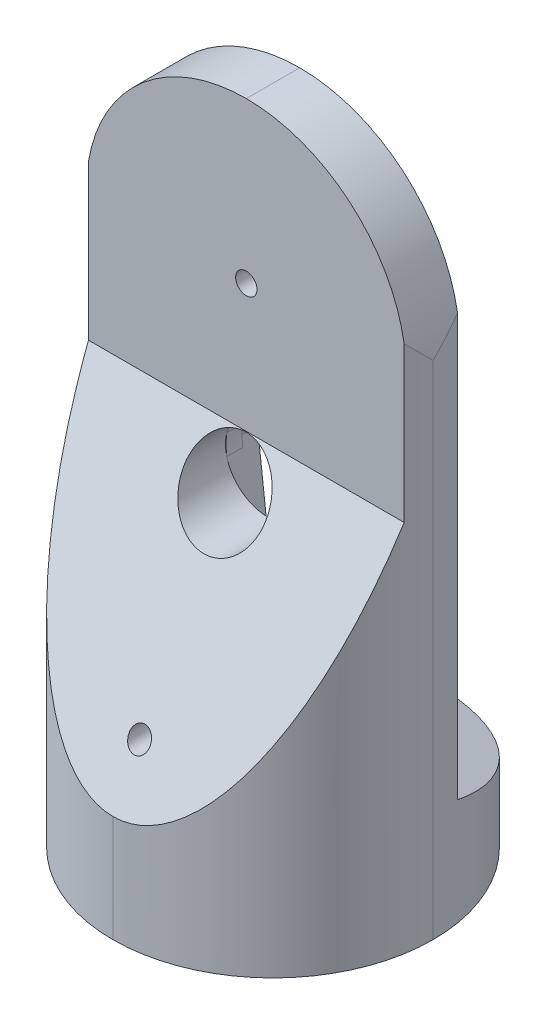
ISO-10303-21;
HEADER;
FILE_DESCRIPTION(('STEP AP214'),'2;1');
FILE_NAME('part.step','',(''),(''),'','','');
FILE_SCHEMA(('AUTOMOTIVE_DESIGN { 1 0 10303 214 1 1 1 1 }'));
ENDSEC;
DATA;
#1=APPLICATION_CONTEXT('core data for automotive mechanical design processes');
#2=APPLICATION_PROTOCOL_DEFINITION('international standard','automotive_design',2000,#1);
#3=PRODUCT_CONTEXT('',#1,'mechanical');
#4=PRODUCT('Part','Part','',(#3));
#5=PRODUCT_RELATED_PRODUCT_CATEGORY('part','',(#4));
#6=PRODUCT_DEFINITION_FORMATION('','',#4);
#7=PRODUCT_DEFINITION_CONTEXT('part definition',#1,'design');
#8=PRODUCT_DEFINITION('design','',#6,#7);
#9=PRODUCT_DEFINITION_SHAPE('','',#8);
#10=(LENGTH_UNIT() NAMED_UNIT(*) SI_UNIT(.MILLI.,.METRE.));
#11=(NAMED_UNIT(*) PLANE_ANGLE_UNIT() SI_UNIT($,.RADIAN.));
#12=(NAMED_UNIT(*) SI_UNIT($,.STERADIAN.) SOLID_ANGLE_UNIT());
#13=UNCERTAINTY_MEASURE_WITH_UNIT(LENGTH_MEASURE(1.E-05),#10,'distance_accuracy_value','');
#14=(GEOMETRIC_REPRESENTATION_CONTEXT(3) GLOBAL_UNCERTAINTY_ASSIGNED_CONTEXT((#13)) GLOBAL_UNIT_ASSIGNED_CONTEXT((#10,
#11,#12)) REPRESENTATION_CONTEXT('',''));
#15=CARTESIAN_POINT('',(0.,0.,0.));
#16=DIRECTION('',(0.,0.,1.));
#17=DIRECTION('',(1.,0.,0.));
#18=AXIS2_PLACEMENT_3D('',#15,#16,#17);
#19=CARTESIAN_POINT('',(4.60663020178833,0.,3.));
#20=DIRECTION('',(0.,0.,1.));
#21=DIRECTION('',(1.,0.,0.));
#22=AXIS2_PLACEMENT_3D('',#19,#20,#21);
#23=PLANE('',#22);
#24=CARTESIAN_POINT('',(0.,0.,3.));
#25=DIRECTION('',(0.,0.,-1.));
#26=DIRECTION('',(-1.,0.,0.));
#27=AXIS2_PLACEMENT_3D('',#24,#25,#26);
#28=CIRCLE('',#27,3.95);
#29=CARTESIAN_POINT('',(-3.84515976235934,0.904016815071853,3.));
#30=VERTEX_POINT('',#29);
#31=CARTESIAN_POINT('',(3.84515976235935,0.904016815071825,3.));
#32=VERTEX_POINT('',#31);
#33=EDGE_CURVE('E231',#30,#32,#28,.T.);
#34=ORIENTED_EDGE('',*,*,#33,.F.);
#35=CARTESIAN_POINT('',(4.60663020178833,0.,3.));
#36=DIRECTION('',(0.,0.,-1.));
#37=DIRECTION('',(1.,0.,0.));
#38=AXIS2_PLACEMENT_3D('',#35,#36,#37);
#39=CIRCLE('',#38,8.5);
#40=CARTESIAN_POINT('',(-3.83711439113562,0.976307968556832,3.));
#41=VERTEX_POINT('',#40);
#42=EDGE_CURVE('E226',#30,#41,#39,.T.);
#43=ORIENTED_EDGE('',*,*,#42,.T.);
#44=DIRECTION('',(0.114859761006686,0.993381716814582,0.));
#45=VECTOR('',#44,1.);
#46=CARTESIAN_POINT('',(-3.3140625,5.5,3.));
#47=LINE('',#46,#45);
#48=CARTESIAN_POINT('',(-3.3140625,5.5,3.));
#49=VERTEX_POINT('',#48);
#50=EDGE_CURVE('E257',#41,#49,#47,.T.);
#51=ORIENTED_EDGE('',*,*,#50,.T.);
#52=DIRECTION('',(1.,0.,0.));
#53=VECTOR('',#52,1.);
#54=CARTESIAN_POINT('',(3.3140625,5.5,3.));
#55=LINE('',#54,#53);
#56=CARTESIAN_POINT('',(3.3140625,5.5,3.));
#57=VERTEX_POINT('',#56);
#58=EDGE_CURVE('E260',#49,#57,#55,.T.);
#59=ORIENTED_EDGE('',*,*,#58,.T.);
#60=DIRECTION('',(0.114859761006686,-0.993381716814582,0.));
#61=VECTOR('',#60,1.);
#62=CARTESIAN_POINT('',(3.3140625,5.5,3.));
#63=LINE('',#62,#61);
#64=CARTESIAN_POINT('',(3.83711439113562,0.976307968556832,3.));
#65=VERTEX_POINT('',#64);
#66=EDGE_CURVE('E263',#57,#65,#63,.T.);
#67=ORIENTED_EDGE('',*,*,#66,.T.);
#68=CARTESIAN_POINT('',(-4.60663020178833,0.,3.));
#69=DIRECTION('',(0.,0.,-1.));
#70=DIRECTION('',(-1.,0.,0.));
#71=AXIS2_PLACEMENT_3D('',#68,#69,#70);
#72=CIRCLE('',#71,8.5);
#73=EDGE_CURVE('E243',#65,#32,#72,.T.);
#74=ORIENTED_EDGE('',*,*,#73,.T.);
#75=EDGE_LOOP('',(#34,#43,#51,#59,#67,#74));
#76=FACE_BOUND('',#75,.T.);
#77=ADVANCED_FACE('F45',(#76),#23,.F.);
#78=CARTESIAN_POINT('',(0.,0.,1.5));
#79=DIRECTION('',(0.,0.,1.));
#80=DIRECTION('',(1.,0.,0.));
#81=AXIS2_PLACEMENT_3D('',#78,#79,#80);
#82=PLANE('',#81);
#83=DIRECTION('',(0.114859761006686,0.993381716814582,0.));
#84=VECTOR('',#83,1.);
#85=CARTESIAN_POINT('',(3.89788857944087,-0.450693366997851,1.5));
#86=LINE('',#85,#84);
#87=CARTESIAN_POINT('',(3.83711439113562,-0.976307968556832,1.5));
#88=VERTEX_POINT('',#87);
#89=CARTESIAN_POINT('',(3.95,0.,1.5));
#90=VERTEX_POINT('',#89);
#91=EDGE_CURVE('E336',#88,#90,#86,.T.);
#92=ORIENTED_EDGE('',*,*,#91,.F.);
#93=CARTESIAN_POINT('',(-4.60663020178833,0.,1.5));
#94=DIRECTION('',(0.,0.,-1.));
#95=DIRECTION('',(-1.,0.,0.));
#96=AXIS2_PLACEMENT_3D('',#93,#94,#95);
#97=CIRCLE('',#96,8.5);
#98=CARTESIAN_POINT('',(3.83711439113562,0.976307968556832,1.5));
#99=VERTEX_POINT('',#98);
#100=EDGE_CURVE('E282',#99,#88,#97,.T.);
#101=ORIENTED_EDGE('',*,*,#100,.F.);
#102=DIRECTION('',(0.114859761006686,-0.993381716814582,0.));
#103=VECTOR('',#102,1.);
#104=CARTESIAN_POINT('',(3.89788857944087,0.450693366997851,1.5));
#105=LINE('',#104,#103);
#106=EDGE_CURVE('E342',#99,#90,#105,.T.);
#107=ORIENTED_EDGE('',*,*,#106,.T.);
#108=EDGE_LOOP('',(#92,#101,#107));
#109=FACE_BOUND('',#108,.T.);
#110=ADVANCED_FACE('F555',(#109),#82,.F.);
#111=CARTESIAN_POINT('',(0.,16.,1.5));
#112=DIRECTION('',(0.,0.,1.));
#113=DIRECTION('',(1.,0.,0.));
#114=AXIS2_PLACEMENT_3D('',#111,#112,#113);
#115=CIRCLE('',#114,1.);
#116=CARTESIAN_POINT('',(1.,16.,1.5));
#117=VERTEX_POINT('',#116);
#118=EDGE_CURVE('E322',#117,#117,#115,.F.);
#119=ORIENTED_EDGE('',*,*,#118,.F.);
#120=EDGE_LOOP('',(#119));
#121=FACE_BOUND('',#120,.T.);
#122=CARTESIAN_POINT('',(2.1,16.,1.5));
#123=VERTEX_POINT('',#122);
#124=CARTESIAN_POINT('',(3.3140625,5.5,1.5));
#125=VERTEX_POINT('',#124);
#126=EDGE_CURVE('E343',#123,#125,#105,.T.);
#127=ORIENTED_EDGE('',*,*,#126,.T.);
#128=DIRECTION('',(1.,0.,0.));
#129=VECTOR('',#128,1.);
#130=CARTESIAN_POINT('',(3.3140625,5.5,1.5));
#131=LINE('',#130,#129);
#132=CARTESIAN_POINT('',(-3.3140625,5.5,1.5));
#133=VERTEX_POINT('',#132);
#134=EDGE_CURVE('E278',#133,#125,#131,.T.);
#135=ORIENTED_EDGE('',*,*,#134,.F.);
#136=DIRECTION('',(-0.114859761006686,-0.993381716814582,0.));
#137=VECTOR('',#136,1.);
#138=CARTESIAN_POINT('',(-3.89788857944087,0.450693366997851,1.5));
#139=LINE('',#138,#137);
#140=CARTESIAN_POINT('',(-2.1,16.,1.5));
#141=VERTEX_POINT('',#140);
#142=EDGE_CURVE('E352',#141,#133,#139,.T.);
#143=ORIENTED_EDGE('',*,*,#142,.F.);
#144=CARTESIAN_POINT('',(0.,16.,1.5));
#145=DIRECTION('',(0.,0.,1.));
#146=DIRECTION('',(1.,0.,0.));
#147=AXIS2_PLACEMENT_3D('',#144,#145,#146);
#148=CIRCLE('',#147,2.1);
#149=EDGE_CURVE('E347',#123,#141,#148,.T.);
#150=ORIENTED_EDGE('',*,*,#149,.F.);
#151=EDGE_LOOP('',(#127,#135,#143,#150));
#152=FACE_BOUND('',#151,.T.);
#153=ADVANCED_FACE('F580',(#121,#152),#82,.F.);
#154=CARTESIAN_POINT('',(-3.83711439113562,0.976307968556832,1.5));
#155=VERTEX_POINT('',#154);
#156=CARTESIAN_POINT('',(-3.95,0.,1.5));
#157=VERTEX_POINT('',#156);
#158=EDGE_CURVE('E351',#155,#157,#139,.T.);
#159=ORIENTED_EDGE('',*,*,#158,.F.);
#160=CARTESIAN_POINT('',(4.60663020178833,0.,1.5));
#161=DIRECTION('',(0.,0.,-1.));
#162=DIRECTION('',(1.,0.,0.));
#163=AXIS2_PLACEMENT_3D('',#160,#161,#162);
#164=CIRCLE('',#163,8.5);
#165=CARTESIAN_POINT('',(-3.83711439113562,-0.976307968556832,1.5));
#166=VERTEX_POINT('',#165);
#167=EDGE_CURVE('E275',#166,#155,#164,.T.);
#168=ORIENTED_EDGE('',*,*,#167,.F.);
#169=DIRECTION('',(-0.114859761006686,0.993381716814582,0.));
#170=VECTOR('',#169,1.);
#171=CARTESIAN_POINT('',(-3.89788857944087,-0.450693366997851,1.5));
#172=LINE('',#171,#170);
#173=EDGE_CURVE('E356',#166,#157,#172,.T.);
#174=ORIENTED_EDGE('',*,*,#173,.T.);
#175=EDGE_LOOP('',(#159,#168,#174));
#176=FACE_BOUND('',#175,.T.);
#177=ADVANCED_FACE('F556',(#176),#82,.F.);
#178=CARTESIAN_POINT('',(-15.,-31.,5.));
#179=DIRECTION('',(0.,1.,0.));
#180=DIRECTION('',(0.,0.,1.));
#181=AXIS2_PLACEMENT_3D('',#178,#179,#180);
#182=PLANE('',#181);
#183=CARTESIAN_POINT('',(0.,-31.,2.5));
#184=DIRECTION('',(0.,-1.,0.));
#185=DIRECTION('',(0.,0.,-1.));
#186=AXIS2_PLACEMENT_3D('',#183,#184,#185);
#187=CIRCLE('',#186,2.5);
#188=CARTESIAN_POINT('',(0.,-31.,0.));
#189=VERTEX_POINT('',#188);
#190=EDGE_CURVE('E290',#189,#189,#187,.T.);
#191=ORIENTED_EDGE('',*,*,#190,.F.);
#192=EDGE_LOOP('',(#191));
#193=FACE_BOUND('',#192,.T.);
#194=CARTESIAN_POINT('',(0.,-31.,2.5));
#195=DIRECTION('',(0.,1.,0.));
#196=DIRECTION('',(0.,0.,1.));
#197=AXIS2_PLACEMENT_3D('',#194,#195,#196);
#198=CIRCLE('',#197,15.);
#199=CARTESIAN_POINT('',(0.,-31.,-12.5));
#200=VERTEX_POINT('',#199);
#201=CARTESIAN_POINT('',(15.,-31.,2.5));
#202=VERTEX_POINT('',#201);
#203=EDGE_CURVE('E416',#200,#202,#198,.F.);
#204=ORIENTED_EDGE('',*,*,#203,.T.);
#205=CARTESIAN_POINT('',(0.,-31.,2.5));
#206=DIRECTION('',(0.,1.,0.));
#207=DIRECTION('',(0.,0.,1.));
#208=AXIS2_PLACEMENT_3D('',#205,#206,#207);
#209=CIRCLE('',#208,15.);
#210=CARTESIAN_POINT('',(0.,-31.,17.5));
#211=VERTEX_POINT('',#210);
#212=EDGE_CURVE('E430',#202,#211,#209,.F.);
#213=ORIENTED_EDGE('',*,*,#212,.T.);
#214=CARTESIAN_POINT('',(0.,-31.,2.5));
#215=DIRECTION('',(0.,1.,0.));
#216=DIRECTION('',(0.,0.,1.));
#217=AXIS2_PLACEMENT_3D('',#214,#215,#216);
#218=CIRCLE('',#217,15.);
#219=CARTESIAN_POINT('',(-15.,-31.,2.5));
#220=VERTEX_POINT('',#219);
#221=EDGE_CURVE('E427',#211,#220,#218,.F.);
#222=ORIENTED_EDGE('',*,*,#221,.T.);
#223=CARTESIAN_POINT('',(0.,-31.,2.5));
#224=DIRECTION('',(0.,1.,0.));
#225=DIRECTION('',(0.,0.,1.));
#226=AXIS2_PLACEMENT_3D('',#223,#224,#225);
#227=CIRCLE('',#226,15.);
#228=EDGE_CURVE('E424',#220,#200,#227,.F.);
#229=ORIENTED_EDGE('',*,*,#228,.T.);
#230=EDGE_LOOP('',(#204,#213,#222,#229));
#231=FACE_BOUND('',#230,.T.);
#232=ADVANCED_FACE('F526',(#193,#231),#182,.F.);
#233=CARTESIAN_POINT('',(0.,0.,5.));
#234=DIRECTION('',(0.,0.,-1.));
#235=DIRECTION('',(-1.,0.,0.));
#236=AXIS2_PLACEMENT_3D('',#233,#234,#235);
#237=PLANE('',#236);
#238=CARTESIAN_POINT('',(0.,16.,5.));
#239=DIRECTION('',(0.,0.,1.));
#240=DIRECTION('',(1.,0.,0.));
#241=AXIS2_PLACEMENT_3D('',#238,#239,#240);
#242=CIRCLE('',#241,1.);
#243=CARTESIAN_POINT('',(1.,16.,5.));
#244=VERTEX_POINT('',#243);
#245=EDGE_CURVE('E318',#244,#244,#242,.T.);
#246=ORIENTED_EDGE('',*,*,#245,.F.);
#247=EDGE_LOOP('',(#246));
#248=FACE_BOUND('',#247,.T.);
#249=DIRECTION('',(0.,1.,0.));
#250=VECTOR('',#249,1.);
#251=CARTESIAN_POINT('',(-14.790199457749,18.5,5.));
#252=LINE('',#251,#250);
#253=CARTESIAN_POINT('',(-14.790199457749,18.5,5.));
#254=VERTEX_POINT('',#253);
#255=CARTESIAN_POINT('',(-14.790199457749,4.00000000000011,5.));
#256=VERTEX_POINT('',#255);
#257=EDGE_CURVE('E434',#254,#256,#252,.F.);
#258=ORIENTED_EDGE('',*,*,#257,.T.);
#259=DIRECTION('',(1.,0.,0.));
#260=VECTOR('',#259,1.);
#261=CARTESIAN_POINT('',(0.,4.00000000000011,5.));
#262=LINE('',#261,#260);
#263=CARTESIAN_POINT('',(14.790199457749,4.0000000000001,5.));
#264=VERTEX_POINT('',#263);
#265=EDGE_CURVE('E460',#256,#264,#262,.T.);
#266=ORIENTED_EDGE('',*,*,#265,.T.);
#267=DIRECTION('',(0.,-1.,0.));
#268=VECTOR('',#267,1.);
#269=CARTESIAN_POINT('',(14.790199457749,-26.,5.));
#270=LINE('',#269,#268);
#271=CARTESIAN_POINT('',(14.790199457749,18.5,5.));
#272=VERTEX_POINT('',#271);
#273=EDGE_CURVE('E438',#264,#272,#270,.F.);
#274=ORIENTED_EDGE('',*,*,#273,.T.);
#275=CARTESIAN_POINT('',(0.,16.,5.));
#276=DIRECTION('',(0.,0.,-1.));
#277=DIRECTION('',(-1.,0.,0.));
#278=AXIS2_PLACEMENT_3D('',#275,#276,#277);
#279=CIRCLE('',#278,15.);
#280=CARTESIAN_POINT('',(0.,31.,5.));
#281=VERTEX_POINT('',#280);
#282=EDGE_CURVE('E409',#272,#281,#279,.F.);
#283=ORIENTED_EDGE('',*,*,#282,.T.);
#284=CARTESIAN_POINT('',(0.,16.,5.));
#285=DIRECTION('',(0.,0.,-1.));
#286=DIRECTION('',(-1.,0.,0.));
#287=AXIS2_PLACEMENT_3D('',#284,#285,#286);
#288=CIRCLE('',#287,15.);
#289=EDGE_CURVE('E412',#281,#254,#288,.F.);
#290=ORIENTED_EDGE('',*,*,#289,.T.);
#291=EDGE_LOOP('',(#258,#266,#274,#283,#290));
#292=FACE_BOUND('',#291,.T.);
#293=ADVANCED_FACE('F532',(#248,#292),#237,.F.);
#294=CARTESIAN_POINT('',(0.,0.,0.));
#295=DIRECTION('',(0.,0.,-1.));
#296=DIRECTION('',(-1.,0.,0.));
#297=AXIS2_PLACEMENT_3D('',#294,#295,#296);
#298=PLANE('',#297);
#299=DIRECTION('',(0.,-1.,0.));
#300=VECTOR('',#299,1.);
#301=CARTESIAN_POINT('',(14.790199457749,18.5,0.));
#302=LINE('',#301,#300);
#303=CARTESIAN_POINT('',(14.790199457749,18.5,0.));
#304=VERTEX_POINT('',#303);
#305=CARTESIAN_POINT('',(14.790199457749,-20.9999999999999,0.));
#306=VERTEX_POINT('',#305);
#307=EDGE_CURVE('E453',#304,#306,#302,.T.);
#308=ORIENTED_EDGE('',*,*,#307,.T.);
#309=DIRECTION('',(-1.,0.,0.));
#310=VECTOR('',#309,1.);
#311=CARTESIAN_POINT('',(0.,-20.9999999999999,0.));
#312=LINE('',#311,#310);
#313=CARTESIAN_POINT('',(-14.790199457749,-20.9999999999999,0.));
#314=VERTEX_POINT('',#313);
#315=EDGE_CURVE('E483',#306,#314,#312,.T.);
#316=ORIENTED_EDGE('',*,*,#315,.T.);
#317=DIRECTION('',(0.,1.,0.));
#318=VECTOR('',#317,1.);
#319=CARTESIAN_POINT('',(-14.790199457749,-26.,0.));
#320=LINE('',#319,#318);
#321=CARTESIAN_POINT('',(-14.790199457749,18.5,0.));
#322=VERTEX_POINT('',#321);
#323=EDGE_CURVE('E457',#314,#322,#320,.T.);
#324=ORIENTED_EDGE('',*,*,#323,.T.);
#325=CARTESIAN_POINT('',(0.,16.,0.));
#326=DIRECTION('',(0.,0.,-1.));
#327=DIRECTION('',(-1.,0.,0.));
#328=AXIS2_PLACEMENT_3D('',#325,#326,#327);
#329=CIRCLE('',#328,15.);
#330=CARTESIAN_POINT('',(0.,31.,0.));
#331=VERTEX_POINT('',#330);
#332=EDGE_CURVE('E406',#322,#331,#329,.T.);
#333=ORIENTED_EDGE('',*,*,#332,.T.);
#334=CARTESIAN_POINT('',(0.,16.,0.));
#335=DIRECTION('',(0.,0.,-1.));
#336=DIRECTION('',(-1.,0.,0.));
#337=AXIS2_PLACEMENT_3D('',#334,#335,#336);
#338=CIRCLE('',#337,15.);
#339=EDGE_CURVE('E402',#331,#304,#338,.T.);
#340=ORIENTED_EDGE('',*,*,#339,.T.);
#341=EDGE_LOOP('',(#308,#316,#324,#333,#340));
#342=FACE_BOUND('',#341,.T.);
#343=CARTESIAN_POINT('',(0.,-16.,0.));
#344=DIRECTION('',(0.,0.,1.));
#345=DIRECTION('',(1.,0.,0.));
#346=AXIS2_PLACEMENT_3D('',#343,#344,#345);
#347=CIRCLE('',#346,2.1);
#348=CARTESIAN_POINT('',(2.1,-16.,0.));
#349=VERTEX_POINT('',#348);
#350=CARTESIAN_POINT('',(-2.1,-16.,0.));
#351=VERTEX_POINT('',#350);
#352=EDGE_CURVE('E331',#349,#351,#347,.F.);
#353=ORIENTED_EDGE('',*,*,#352,.F.);
#354=DIRECTION('',(0.114859761006686,0.993381716814582,0.));
#355=VECTOR('',#354,1.);
#356=CARTESIAN_POINT('',(3.89788857944087,-0.450693366997851,0.));
#357=LINE('',#356,#355);
#358=CARTESIAN_POINT('',(3.95,0.,0.));
#359=VERTEX_POINT('',#358);
#360=EDGE_CURVE('E364',#349,#359,#357,.T.);
#361=ORIENTED_EDGE('',*,*,#360,.T.);
#362=DIRECTION('',(0.114859761006686,-0.993381716814582,0.));
#363=VECTOR('',#362,1.);
#364=CARTESIAN_POINT('',(3.89788857944087,0.450693366997851,0.));
#365=LINE('',#364,#363);
#366=CARTESIAN_POINT('',(2.1,16.,0.));
#367=VERTEX_POINT('',#366);
#368=EDGE_CURVE('E368',#367,#359,#365,.T.);
#369=ORIENTED_EDGE('',*,*,#368,.F.);
#370=CARTESIAN_POINT('',(0.,16.,0.));
#371=DIRECTION('',(0.,0.,1.));
#372=DIRECTION('',(1.,0.,0.));
#373=AXIS2_PLACEMENT_3D('',#370,#371,#372);
#374=CIRCLE('',#373,2.1);
#375=CARTESIAN_POINT('',(-2.1,16.,0.));
#376=VERTEX_POINT('',#375);
#377=EDGE_CURVE('E372',#367,#376,#374,.T.);
#378=ORIENTED_EDGE('',*,*,#377,.T.);
#379=DIRECTION('',(-0.114859761006686,-0.993381716814582,0.));
#380=VECTOR('',#379,1.);
#381=CARTESIAN_POINT('',(-3.89788857944087,0.450693366997851,0.));
#382=LINE('',#381,#380);
#383=CARTESIAN_POINT('',(-3.95,0.,0.));
#384=VERTEX_POINT('',#383);
#385=EDGE_CURVE('E376',#376,#384,#382,.T.);
#386=ORIENTED_EDGE('',*,*,#385,.T.);
#387=DIRECTION('',(-0.114859761006686,0.993381716814582,0.));
#388=VECTOR('',#387,1.);
#389=CARTESIAN_POINT('',(-3.89788857944087,-0.450693366997851,0.));
#390=LINE('',#389,#388);
#391=EDGE_CURVE('E337',#351,#384,#390,.T.);
#392=ORIENTED_EDGE('',*,*,#391,.F.);
#393=EDGE_LOOP('',(#353,#361,#369,#378,#386,#392));
#394=FACE_BOUND('',#393,.T.);
#395=ADVANCED_FACE('F501',(#342,#394),#298,.T.);
#396=CARTESIAN_POINT('',(0.,-16.,1.5));
#397=DIRECTION('',(0.,0.,-1.));
#398=DIRECTION('',(-1.,0.,0.));
#399=AXIS2_PLACEMENT_3D('',#396,#397,#398);
#400=CYLINDRICAL_SURFACE('',#399,2.1);
#401=ORIENTED_EDGE('',*,*,#352,.T.);
#402=DIRECTION('',(0.,0.,-1.));
#403=VECTOR('',#402,1.);
#404=CARTESIAN_POINT('',(-2.1,-16.,1.5));
#405=LINE('',#404,#403);
#406=CARTESIAN_POINT('',(-2.1,-16.,1.5));
#407=VERTEX_POINT('',#406);
#408=EDGE_CURVE('E361',#407,#351,#405,.T.);
#409=ORIENTED_EDGE('',*,*,#408,.F.);
#410=CARTESIAN_POINT('',(0.,-16.,1.5));
#411=DIRECTION('',(0.,0.,1.));
#412=DIRECTION('',(1.,0.,0.));
#413=AXIS2_PLACEMENT_3D('',#410,#411,#412);
#414=CIRCLE('',#413,2.1);
#415=CARTESIAN_POINT('',(2.1,-16.,1.5));
#416=VERTEX_POINT('',#415);
#417=EDGE_CURVE('E332',#416,#407,#414,.F.);
#418=ORIENTED_EDGE('',*,*,#417,.F.);
#419=DIRECTION('',(0.,0.,-1.));
#420=VECTOR('',#419,1.);
#421=CARTESIAN_POINT('',(2.1,-16.,1.5));
#422=LINE('',#421,#420);
#423=EDGE_CURVE('E399',#416,#349,#422,.T.);
#424=ORIENTED_EDGE('',*,*,#423,.T.);
#425=EDGE_LOOP('',(#401,#409,#418,#424));
#426=FACE_BOUND('',#425,.T.);
#427=ADVANCED_FACE('F725',(#426),#400,.F.);
#428=CARTESIAN_POINT('',(3.89788857944087,-0.450693366997851,1.5));
#429=DIRECTION('',(-0.993381716814582,0.114859761006686,0.));
#430=DIRECTION('',(-0.114859761006686,-0.993381716814582,0.));
#431=AXIS2_PLACEMENT_3D('',#428,#429,#430);
#432=PLANE('',#431);
#433=ORIENTED_EDGE('',*,*,#360,.F.);
#434=ORIENTED_EDGE('',*,*,#423,.F.);
#435=CARTESIAN_POINT('',(3.3140625,-5.5,1.5));
#436=VERTEX_POINT('',#435);
#437=EDGE_CURVE('E338',#416,#436,#86,.T.);
#438=ORIENTED_EDGE('',*,*,#437,.T.);
#439=DIRECTION('',(0.,0.,-1.));
#440=VECTOR('',#439,1.);
#441=CARTESIAN_POINT('',(3.3140625,-5.5,3.));
#442=LINE('',#441,#440);
#443=CARTESIAN_POINT('',(3.3140625,-5.5,3.));
#444=VERTEX_POINT('',#443);
#445=EDGE_CURVE('E71',#444,#436,#442,.T.);
#446=ORIENTED_EDGE('',*,*,#445,.F.);
#447=DIRECTION('',(-0.114859761006687,-0.993381716814582,0.));
#448=VECTOR('',#447,1.);
#449=CARTESIAN_POINT('',(3.83711439113562,-0.976307968556833,3.));
#450=LINE('',#449,#448);
#451=CARTESIAN_POINT('',(3.83711439113562,-0.976307968556832,3.));
#452=VERTEX_POINT('',#451);
#453=EDGE_CURVE('E286',#452,#444,#450,.T.);
#454=ORIENTED_EDGE('',*,*,#453,.F.);
#455=DIRECTION('',(0.,0.,-1.));
#456=VECTOR('',#455,1.);
#457=CARTESIAN_POINT('',(3.83711439113562,-0.976307968556832,3.));
#458=LINE('',#457,#456);
#459=EDGE_CURVE('E287',#452,#88,#458,.T.);
#460=ORIENTED_EDGE('',*,*,#459,.T.);
#461=ORIENTED_EDGE('',*,*,#91,.T.);
#462=DIRECTION('',(0.,0.,-1.));
#463=VECTOR('',#462,1.);
#464=CARTESIAN_POINT('',(3.95,0.,1.5));
#465=LINE('',#464,#463);
#466=EDGE_CURVE('E396',#90,#359,#465,.T.);
#467=ORIENTED_EDGE('',*,*,#466,.T.);
#468=EDGE_LOOP('',(#433,#434,#438,#446,#454,#460,#461,#467));
#469=FACE_BOUND('',#468,.T.);
#470=ADVANCED_FACE('F614',(#469),#432,.T.);
#471=CARTESIAN_POINT('',(3.89788857944087,0.450693366997851,1.5));
#472=DIRECTION('',(0.993381716814582,0.114859761006686,0.));
#473=DIRECTION('',(-0.114859761006686,0.993381716814582,0.));
#474=AXIS2_PLACEMENT_3D('',#471,#472,#473);
#475=PLANE('',#474);
#476=ORIENTED_EDGE('',*,*,#368,.T.);
#477=ORIENTED_EDGE('',*,*,#466,.F.);
#478=ORIENTED_EDGE('',*,*,#106,.F.);
#479=DIRECTION('',(0.,0.,-1.));
#480=VECTOR('',#479,1.);
#481=CARTESIAN_POINT('',(3.83711439113562,0.976307968556832,3.));
#482=LINE('',#481,#480);
#483=EDGE_CURVE('E291',#65,#99,#482,.T.);
#484=ORIENTED_EDGE('',*,*,#483,.F.);
#485=ORIENTED_EDGE('',*,*,#66,.F.);
#486=DIRECTION('',(0.,0.,-1.));
#487=VECTOR('',#486,1.);
#488=CARTESIAN_POINT('',(3.3140625,5.5,3.));
#489=LINE('',#488,#487);
#490=EDGE_CURVE('E294',#57,#125,#489,.T.);
#491=ORIENTED_EDGE('',*,*,#490,.T.);
#492=ORIENTED_EDGE('',*,*,#126,.F.);
#493=DIRECTION('',(0.,0.,-1.));
#494=VECTOR('',#493,1.);
#495=CARTESIAN_POINT('',(2.1,16.,1.5));
#496=LINE('',#495,#494);
#497=EDGE_CURVE('E393',#123,#367,#496,.T.);
#498=ORIENTED_EDGE('',*,*,#497,.T.);
#499=EDGE_LOOP('',(#476,#477,#478,#484,#485,#491,#492,#498));
#500=FACE_BOUND('',#499,.T.);
#501=ADVANCED_FACE('F600',(#500),#475,.F.);
#502=CARTESIAN_POINT('',(0.,16.,1.5));
#503=DIRECTION('',(0.,0.,-1.));
#504=DIRECTION('',(-1.,0.,0.));
#505=AXIS2_PLACEMENT_3D('',#502,#503,#504);
#506=CYLINDRICAL_SURFACE('',#505,2.1);
#507=ORIENTED_EDGE('',*,*,#377,.F.);
#508=ORIENTED_EDGE('',*,*,#497,.F.);
#509=ORIENTED_EDGE('',*,*,#149,.T.);
#510=DIRECTION('',(0.,0.,-1.));
#511=VECTOR('',#510,1.);
#512=CARTESIAN_POINT('',(-2.1,16.,1.5));
#513=LINE('',#512,#511);
#514=EDGE_CURVE('E389',#141,#376,#513,.T.);
#515=ORIENTED_EDGE('',*,*,#514,.T.);
#516=EDGE_LOOP('',(#507,#508,#509,#515));
#517=FACE_BOUND('',#516,.T.);
#518=ADVANCED_FACE('F704',(#517),#506,.F.);
#519=CARTESIAN_POINT('',(-3.89788857944087,0.450693366997851,1.5));
#520=DIRECTION('',(0.993381716814582,-0.114859761006686,0.));
#521=DIRECTION('',(0.114859761006686,0.993381716814582,0.));
#522=AXIS2_PLACEMENT_3D('',#519,#520,#521);
#523=PLANE('',#522);
#524=ORIENTED_EDGE('',*,*,#385,.F.);
#525=ORIENTED_EDGE('',*,*,#514,.F.);
#526=ORIENTED_EDGE('',*,*,#142,.T.);
#527=DIRECTION('',(0.,0.,-1.));
#528=VECTOR('',#527,1.);
#529=CARTESIAN_POINT('',(-3.3140625,5.5,3.));
#530=LINE('',#529,#528);
#531=EDGE_CURVE('E297',#49,#133,#530,.T.);
#532=ORIENTED_EDGE('',*,*,#531,.F.);
#533=ORIENTED_EDGE('',*,*,#50,.F.);
#534=DIRECTION('',(0.,0.,-1.));
#535=VECTOR('',#534,1.);
#536=CARTESIAN_POINT('',(-3.83711439113562,0.976307968556832,3.));
#537=LINE('',#536,#535);
#538=EDGE_CURVE('E247',#41,#155,#537,.T.);
#539=ORIENTED_EDGE('',*,*,#538,.T.);
#540=ORIENTED_EDGE('',*,*,#158,.T.);
#541=DIRECTION('',(0.,0.,-1.));
#542=VECTOR('',#541,1.);
#543=CARTESIAN_POINT('',(-3.95,0.,1.5));
#544=LINE('',#543,#542);
#545=EDGE_CURVE('E386',#157,#384,#544,.T.);
#546=ORIENTED_EDGE('',*,*,#545,.T.);
#547=EDGE_LOOP('',(#524,#525,#526,#532,#533,#539,#540,#546));
#548=FACE_BOUND('',#547,.T.);
#549=ADVANCED_FACE('F695',(#548),#523,.T.);
#550=CARTESIAN_POINT('',(-3.89788857944087,-0.450693366997851,1.5));
#551=DIRECTION('',(-0.993381716814582,-0.114859761006686,0.));
#552=DIRECTION('',(0.114859761006686,-0.993381716814582,0.));
#553=AXIS2_PLACEMENT_3D('',#550,#551,#552);
#554=PLANE('',#553);
#555=ORIENTED_EDGE('',*,*,#391,.T.);
#556=ORIENTED_EDGE('',*,*,#545,.F.);
#557=ORIENTED_EDGE('',*,*,#173,.F.);
#558=DIRECTION('',(0.,0.,-1.));
#559=VECTOR('',#558,1.);
#560=CARTESIAN_POINT('',(-3.83711439113562,-0.976307968556832,3.));
#561=LINE('',#560,#559);
#562=CARTESIAN_POINT('',(-3.83711439113562,-0.976307968556832,3.));
#563=VERTEX_POINT('',#562);
#564=EDGE_CURVE('E302',#563,#166,#561,.T.);
#565=ORIENTED_EDGE('',*,*,#564,.F.);
#566=DIRECTION('',(-0.114859761006686,0.993381716814582,0.));
#567=VECTOR('',#566,1.);
#568=CARTESIAN_POINT('',(-3.83711439113562,-0.976307968556832,3.));
#569=LINE('',#568,#567);
#570=CARTESIAN_POINT('',(-3.3140625,-5.5,3.));
#571=VERTEX_POINT('',#570);
#572=EDGE_CURVE('E250',#571,#563,#569,.T.);
#573=ORIENTED_EDGE('',*,*,#572,.F.);
#574=DIRECTION('',(0.,0.,-1.));
#575=VECTOR('',#574,1.);
#576=CARTESIAN_POINT('',(-3.3140625,-5.5,3.));
#577=LINE('',#576,#575);
#578=CARTESIAN_POINT('',(-3.3140625,-5.5,1.5));
#579=VERTEX_POINT('',#578);
#580=EDGE_CURVE('E305',#571,#579,#577,.T.);
#581=ORIENTED_EDGE('',*,*,#580,.T.);
#582=EDGE_CURVE('E357',#407,#579,#172,.T.);
#583=ORIENTED_EDGE('',*,*,#582,.F.);
#584=ORIENTED_EDGE('',*,*,#408,.T.);
#585=EDGE_LOOP('',(#555,#556,#557,#565,#573,#581,#583,#584));
#586=FACE_BOUND('',#585,.T.);
#587=ADVANCED_FACE('F553',(#586),#554,.F.);
#588=CARTESIAN_POINT('',(0.,-16.,1.5));
#589=DIRECTION('',(0.,0.,1.));
#590=DIRECTION('',(1.,0.,0.));
#591=AXIS2_PLACEMENT_3D('',#588,#589,#590);
#592=CIRCLE('',#591,1.);
#593=CARTESIAN_POINT('',(1.,-16.,1.5));
#594=VERTEX_POINT('',#593);
#595=EDGE_CURVE('E327',#594,#594,#592,.F.);
#596=ORIENTED_EDGE('',*,*,#595,.F.);
#597=EDGE_LOOP('',(#596));
#598=FACE_BOUND('',#597,.T.);
#599=ORIENTED_EDGE('',*,*,#582,.T.);
#600=DIRECTION('',(-1.,0.,0.));
#601=VECTOR('',#600,1.);
#602=CARTESIAN_POINT('',(3.3140625,-5.5,1.5));
#603=LINE('',#602,#601);
#604=EDGE_CURVE('E272',#436,#579,#603,.T.);
#605=ORIENTED_EDGE('',*,*,#604,.F.);
#606=ORIENTED_EDGE('',*,*,#437,.F.);
#607=ORIENTED_EDGE('',*,*,#417,.T.);
#608=EDGE_LOOP('',(#599,#605,#606,#607));
#609=FACE_BOUND('',#608,.T.);
#610=ADVANCED_FACE('F547',(#598,#609),#82,.F.);
#611=CARTESIAN_POINT('',(0.,-16.,5.));
#612=DIRECTION('',(0.,0.,-1.));
#613=DIRECTION('',(-1.,0.,0.));
#614=AXIS2_PLACEMENT_3D('',#611,#612,#613);
#615=CYLINDRICAL_SURFACE('',#614,1.);
#616=CARTESIAN_POINT('',(0.,-16.,15.0000000000002));
#617=DIRECTION('',(0.,-0.447213595499962,-0.894427190999914));
#618=DIRECTION('',(0.,0.894427190999914,-0.447213595499962));
#619=AXIS2_PLACEMENT_3D('',#616,#617,#618);
#620=ELLIPSE('',#619,1.1180339887499,1.);
#621=CARTESIAN_POINT('',(0.,-15.,14.5000000000002));
#622=VERTEX_POINT('',#621);
#623=EDGE_CURVE('E323',#622,#622,#620,.F.);
#624=ORIENTED_EDGE('',*,*,#623,.T.);
#625=EDGE_LOOP('',(#624));
#626=FACE_BOUND('',#625,.T.);
#627=ORIENTED_EDGE('',*,*,#595,.T.);
#628=EDGE_LOOP('',(#627));
#629=FACE_BOUND('',#628,.T.);
#630=ADVANCED_FACE('F543',(#626,#629),#615,.F.);
#631=CARTESIAN_POINT('',(0.,16.,5.));
#632=DIRECTION('',(0.,0.,-1.));
#633=DIRECTION('',(-1.,0.,0.));
#634=AXIS2_PLACEMENT_3D('',#631,#632,#633);
#635=CYLINDRICAL_SURFACE('',#634,1.);
#636=ORIENTED_EDGE('',*,*,#245,.T.);
#637=EDGE_LOOP('',(#636));
#638=FACE_BOUND('',#637,.T.);
#639=ORIENTED_EDGE('',*,*,#118,.T.);
#640=EDGE_LOOP('',(#639));
#641=FACE_BOUND('',#640,.T.);
#642=ADVANCED_FACE('F546',(#638,#641),#635,.F.);
#643=CARTESIAN_POINT('',(0.,16.,5.));
#644=DIRECTION('',(0.,0.,-1.));
#645=DIRECTION('',(-1.,0.,0.));
#646=AXIS2_PLACEMENT_3D('',#643,#644,#645);
#647=CYLINDRICAL_SURFACE('',#646,15.);
#648=ORIENTED_EDGE('',*,*,#282,.F.);
#649=CARTESIAN_POINT('',(0.,16.,2.5));
#650=DIRECTION('',(0.,0.707106781186547,-0.707106781186547));
#651=DIRECTION('',(0.,-0.707106781186547,-0.707106781186547));
#652=AXIS2_PLACEMENT_3D('',#649,#650,#651);
#653=ELLIPSE('',#652,21.2132034355964,15.);
#654=CARTESIAN_POINT('',(15.,16.,2.5));
#655=VERTEX_POINT('',#654);
#656=EDGE_CURVE('E444',#272,#655,#653,.T.);
#657=ORIENTED_EDGE('',*,*,#656,.T.);
#658=CARTESIAN_POINT('',(0.,16.,2.5));
#659=DIRECTION('',(0.,-0.707106781186547,-0.707106781186547));
#660=DIRECTION('',(0.,0.707106781186547,-0.707106781186547));
#661=AXIS2_PLACEMENT_3D('',#658,#659,#660);
#662=ELLIPSE('',#661,21.2132034355964,15.);
#663=EDGE_CURVE('E441',#655,#304,#662,.F.);
#664=ORIENTED_EDGE('',*,*,#663,.T.);
#665=ORIENTED_EDGE('',*,*,#339,.F.);
#666=DIRECTION('',(0.,0.,-1.));
#667=VECTOR('',#666,1.);
#668=CARTESIAN_POINT('',(0.,31.,5.));
#669=LINE('',#668,#667);
#670=EDGE_CURVE('E417',#281,#331,#669,.T.);
#671=ORIENTED_EDGE('',*,*,#670,.F.);
#672=EDGE_LOOP('',(#648,#657,#664,#665,#671));
#673=FACE_BOUND('',#672,.T.);
#674=ADVANCED_FACE('F517',(#673),#647,.T.);
#675=CARTESIAN_POINT('',(0.,16.,5.));
#676=DIRECTION('',(0.,0.,-1.));
#677=DIRECTION('',(-1.,0.,0.));
#678=AXIS2_PLACEMENT_3D('',#675,#676,#677);
#679=CYLINDRICAL_SURFACE('',#678,15.);
#680=CARTESIAN_POINT('',(0.,16.,2.5));
#681=DIRECTION('',(0.,-0.707106781186547,-0.707106781186547));
#682=DIRECTION('',(0.,0.707106781186547,-0.707106781186547));
#683=AXIS2_PLACEMENT_3D('',#680,#681,#682);
#684=ELLIPSE('',#683,21.2132034355964,15.);
#685=CARTESIAN_POINT('',(-15.,16.,2.5));
#686=VERTEX_POINT('',#685);
#687=EDGE_CURVE('E447',#322,#686,#684,.F.);
#688=ORIENTED_EDGE('',*,*,#687,.T.);
#689=CARTESIAN_POINT('',(0.,16.,2.5));
#690=DIRECTION('',(0.,0.707106781186547,-0.707106781186547));
#691=DIRECTION('',(0.,-0.707106781186547,-0.707106781186547));
#692=AXIS2_PLACEMENT_3D('',#689,#690,#691);
#693=ELLIPSE('',#692,21.2132034355964,15.);
#694=EDGE_CURVE('E450',#686,#254,#693,.T.);
#695=ORIENTED_EDGE('',*,*,#694,.T.);
#696=ORIENTED_EDGE('',*,*,#289,.F.);
#697=ORIENTED_EDGE('',*,*,#670,.T.);
#698=ORIENTED_EDGE('',*,*,#332,.F.);
#699=EDGE_LOOP('',(#688,#695,#696,#697,#698));
#700=FACE_BOUND('',#699,.T.);
#701=ADVANCED_FACE('F512',(#700),#679,.T.);
#702=CARTESIAN_POINT('',(0.,0.,2.5));
#703=DIRECTION('',(0.,1.,0.));
#704=DIRECTION('',(0.,0.,1.));
#705=AXIS2_PLACEMENT_3D('',#702,#703,#704);
#706=CYLINDRICAL_SURFACE('',#705,15.);
#707=DIRECTION('',(0.,1.,0.));
#708=VECTOR('',#707,1.);
#709=CARTESIAN_POINT('',(0.,0.,-12.5));
#710=LINE('',#709,#708);
#711=CARTESIAN_POINT('',(0.,-25.1666666666666,-12.5));
#712=VERTEX_POINT('',#711);
#713=EDGE_CURVE('E467',#200,#712,#710,.T.);
#714=ORIENTED_EDGE('',*,*,#713,.F.);
#715=ORIENTED_EDGE('',*,*,#228,.F.);
#716=DIRECTION('',(0.,1.,0.));
#717=VECTOR('',#716,1.);
#718=CARTESIAN_POINT('',(-15.,-31.,2.5));
#719=LINE('',#718,#717);
#720=EDGE_CURVE('E421',#686,#220,#719,.F.);
#721=ORIENTED_EDGE('',*,*,#720,.F.);
#722=ORIENTED_EDGE('',*,*,#687,.F.);
#723=ORIENTED_EDGE('',*,*,#323,.F.);
#724=CARTESIAN_POINT('',(0.,-20.1666666666665,2.5));
#725=DIRECTION('',(0.,-0.948683298050512,0.316227766016843));
#726=DIRECTION('',(0.,0.316227766016843,0.948683298050512));
#727=AXIS2_PLACEMENT_3D('',#724,#725,#726);
#728=ELLIPSE('',#727,15.8113883008419,15.);
#729=EDGE_CURVE('E11',#314,#712,#728,.T.);
#730=ORIENTED_EDGE('',*,*,#729,.T.);
#731=EDGE_LOOP('',(#714,#715,#721,#722,#723,#730));
#732=FACE_BOUND('',#731,.T.);
#733=ADVANCED_FACE('F506',(#732),#706,.T.);
#734=CARTESIAN_POINT('',(0.,-31.,2.5));
#735=DIRECTION('',(0.,1.,0.));
#736=DIRECTION('',(0.,0.,1.));
#737=AXIS2_PLACEMENT_3D('',#734,#735,#736);
#738=CYLINDRICAL_SURFACE('',#737,15.);
#739=ORIENTED_EDGE('',*,*,#720,.T.);
#740=ORIENTED_EDGE('',*,*,#221,.F.);
#741=DIRECTION('',(0.,1.,0.));
#742=VECTOR('',#741,1.);
#743=CARTESIAN_POINT('',(0.,0.,17.5));
#744=LINE('',#743,#742);
#745=CARTESIAN_POINT('',(0.,-20.9999999999996,17.5));
#746=VERTEX_POINT('',#745);
#747=EDGE_CURVE('E464',#746,#211,#744,.F.);
#748=ORIENTED_EDGE('',*,*,#747,.F.);
#749=CARTESIAN_POINT('',(0.,9.00000000000005,2.5));
#750=DIRECTION('',(0.,-0.447213595499962,-0.894427190999914));
#751=DIRECTION('',(0.,0.894427190999914,-0.447213595499962));
#752=AXIS2_PLACEMENT_3D('',#749,#750,#751);
#753=ELLIPSE('',#752,33.5410196624966,15.);
#754=EDGE_CURVE('E480',#746,#256,#753,.T.);
#755=ORIENTED_EDGE('',*,*,#754,.T.);
#756=ORIENTED_EDGE('',*,*,#257,.F.);
#757=ORIENTED_EDGE('',*,*,#694,.F.);
#758=EDGE_LOOP('',(#739,#740,#748,#755,#756,#757));
#759=FACE_BOUND('',#758,.T.);
#760=ADVANCED_FACE('F529',(#759),#738,.T.);
#761=CARTESIAN_POINT('',(0.,0.,2.5));
#762=DIRECTION('',(0.,-1.,0.));
#763=DIRECTION('',(0.,0.,-1.));
#764=AXIS2_PLACEMENT_3D('',#761,#762,#763);
#765=CYLINDRICAL_SURFACE('',#764,15.);
#766=ORIENTED_EDGE('',*,*,#307,.F.);
#767=ORIENTED_EDGE('',*,*,#663,.F.);
#768=DIRECTION('',(0.,-1.,0.));
#769=VECTOR('',#768,1.);
#770=CARTESIAN_POINT('',(15.,-31.,2.5));
#771=LINE('',#770,#769);
#772=EDGE_CURVE('E314',#202,#655,#771,.F.);
#773=ORIENTED_EDGE('',*,*,#772,.F.);
#774=ORIENTED_EDGE('',*,*,#203,.F.);
#775=ORIENTED_EDGE('',*,*,#713,.T.);
#776=CARTESIAN_POINT('',(0.,-20.1666666666665,2.5));
#777=DIRECTION('',(0.,-0.948683298050512,0.316227766016843));
#778=DIRECTION('',(0.,-0.316227766016843,-0.948683298050512));
#779=AXIS2_PLACEMENT_3D('',#776,#777,#778);
#780=ELLIPSE('',#779,15.8113883008419,15.);
#781=EDGE_CURVE('E56',#712,#306,#780,.T.);
#782=ORIENTED_EDGE('',*,*,#781,.T.);
#783=EDGE_LOOP('',(#766,#767,#773,#774,#775,#782));
#784=FACE_BOUND('',#783,.T.);
#785=ADVANCED_FACE('F494',(#784),#765,.T.);
#786=CARTESIAN_POINT('',(0.,-31.,2.5));
#787=DIRECTION('',(0.,-1.,0.));
#788=DIRECTION('',(0.,0.,-1.));
#789=AXIS2_PLACEMENT_3D('',#786,#787,#788);
#790=CYLINDRICAL_SURFACE('',#789,15.);
#791=ORIENTED_EDGE('',*,*,#273,.F.);
#792=CARTESIAN_POINT('',(0.,9.00000000000005,2.5));
#793=DIRECTION('',(0.,-0.447213595499962,-0.894427190999914));
#794=DIRECTION('',(0.,-0.894427190999914,0.447213595499962));
#795=AXIS2_PLACEMENT_3D('',#792,#793,#794);
#796=ELLIPSE('',#795,33.5410196624966,15.);
#797=EDGE_CURVE('E476',#264,#746,#796,.T.);
#798=ORIENTED_EDGE('',*,*,#797,.T.);
#799=ORIENTED_EDGE('',*,*,#747,.T.);
#800=ORIENTED_EDGE('',*,*,#212,.F.);
#801=ORIENTED_EDGE('',*,*,#772,.T.);
#802=ORIENTED_EDGE('',*,*,#656,.F.);
#803=EDGE_LOOP('',(#791,#798,#799,#800,#801,#802));
#804=FACE_BOUND('',#803,.T.);
#805=ADVANCED_FACE('F523',(#804),#790,.T.);
#806=CARTESIAN_POINT('',(0.,-28.,2.5));
#807=DIRECTION('',(0.,-1.,0.));
#808=DIRECTION('',(0.,0.,-1.));
#809=AXIS2_PLACEMENT_3D('',#806,#807,#808);
#810=CYLINDRICAL_SURFACE('',#809,2.5);
#811=CARTESIAN_POINT('',(0.,-28.,2.5));
#812=DIRECTION('',(0.,-1.,0.));
#813=DIRECTION('',(0.,0.,-1.));
#814=AXIS2_PLACEMENT_3D('',#811,#812,#813);
#815=CIRCLE('',#814,2.5);
#816=CARTESIAN_POINT('',(0.,-28.,0.));
#817=VERTEX_POINT('',#816);
#818=EDGE_CURVE('E310',#817,#817,#815,.T.);
#819=ORIENTED_EDGE('',*,*,#818,.F.);
#820=EDGE_LOOP('',(#819));
#821=FACE_BOUND('',#820,.T.);
#822=ORIENTED_EDGE('',*,*,#190,.T.);
#823=EDGE_LOOP('',(#822));
#824=FACE_BOUND('',#823,.T.);
#825=ADVANCED_FACE('F800',(#821,#824),#810,.F.);
#826=CARTESIAN_POINT('',(0.,-28.,2.5));
#827=DIRECTION('',(0.,-1.,0.));
#828=DIRECTION('',(0.,0.,-1.));
#829=AXIS2_PLACEMENT_3D('',#826,#827,#828);
#830=PLANE('',#829);
#831=ORIENTED_EDGE('',*,*,#818,.T.);
#832=EDGE_LOOP('',(#831));
#833=FACE_BOUND('',#832,.T.);
#834=ADVANCED_FACE('F539',(#833),#830,.T.);
#835=CARTESIAN_POINT('',(0.,4.00000000000011,5.));
#836=DIRECTION('',(0.,-0.447213595499962,-0.894427190999914));
#837=DIRECTION('',(1.,0.,0.));
#838=AXIS2_PLACEMENT_3D('',#835,#836,#837);
#839=PLANE('',#838);
#840=CARTESIAN_POINT('',(0.,0.,7.00000000000008));
#841=DIRECTION('',(0.,-0.447213595499962,-0.894427190999914));
#842=DIRECTION('',(0.,0.894427190999914,-0.447213595499962));
#843=AXIS2_PLACEMENT_3D('',#840,#841,#842);
#844=ELLIPSE('',#843,4.4162342555621,3.95);
#845=CARTESIAN_POINT('',(0.,3.95,5.02500000000005));
#846=VERTEX_POINT('',#845);
#847=EDGE_CURVE('E50',#846,#846,#844,.T.);
#848=ORIENTED_EDGE('',*,*,#847,.T.);
#849=EDGE_LOOP('',(#848));
#850=FACE_BOUND('',#849,.T.);
#851=ORIENTED_EDGE('',*,*,#265,.F.);
#852=ORIENTED_EDGE('',*,*,#754,.F.);
#853=ORIENTED_EDGE('',*,*,#797,.F.);
#854=EDGE_LOOP('',(#851,#852,#853));
#855=FACE_BOUND('',#854,.T.);
#856=ORIENTED_EDGE('',*,*,#623,.F.);
#857=EDGE_LOOP('',(#856));
#858=FACE_BOUND('',#857,.T.);
#859=ADVANCED_FACE('F536',(#850,#855,#858),#839,.F.);
#860=CARTESIAN_POINT('',(15.,-26.,-15.));
#861=DIRECTION('',(0.,-0.948683298050512,0.316227766016843));
#862=DIRECTION('',(1.,0.,0.));
#863=AXIS2_PLACEMENT_3D('',#860,#861,#862);
#864=PLANE('',#863);
#865=ORIENTED_EDGE('',*,*,#729,.F.);
#866=ORIENTED_EDGE('',*,*,#315,.F.);
#867=ORIENTED_EDGE('',*,*,#781,.F.);
#868=EDGE_LOOP('',(#865,#866,#867));
#869=FACE_BOUND('',#868,.T.);
#870=ADVANCED_FACE('F48',(#869),#864,.F.);
#871=CARTESIAN_POINT('',(-4.60663020178833,0.,3.));
#872=DIRECTION('',(0.,0.,-1.));
#873=DIRECTION('',(-1.,0.,0.));
#874=AXIS2_PLACEMENT_3D('',#871,#872,#873);
#875=CYLINDRICAL_SURFACE('',#874,8.5);
#876=ORIENTED_EDGE('',*,*,#100,.T.);
#877=ORIENTED_EDGE('',*,*,#459,.F.);
#878=CARTESIAN_POINT('',(3.84515976235935,-0.904016815071825,3.));
#879=VERTEX_POINT('',#878);
#880=EDGE_CURVE('E268',#879,#452,#72,.T.);
#881=ORIENTED_EDGE('',*,*,#880,.F.);
#882=EDGE_CURVE('E271',#32,#879,#72,.T.);
#883=ORIENTED_EDGE('',*,*,#882,.F.);
#884=ORIENTED_EDGE('',*,*,#73,.F.);
#885=ORIENTED_EDGE('',*,*,#483,.T.);
#886=EDGE_LOOP('',(#876,#877,#881,#883,#884,#885));
#887=FACE_BOUND('',#886,.T.);
#888=ADVANCED_FACE('F585',(#887),#875,.F.);
#889=CARTESIAN_POINT('',(3.3140625,5.5,3.));
#890=DIRECTION('',(0.,1.,0.));
#891=DIRECTION('',(0.,0.,1.));
#892=AXIS2_PLACEMENT_3D('',#889,#890,#891);
#893=PLANE('',#892);
#894=ORIENTED_EDGE('',*,*,#134,.T.);
#895=ORIENTED_EDGE('',*,*,#490,.F.);
#896=ORIENTED_EDGE('',*,*,#58,.F.);
#897=ORIENTED_EDGE('',*,*,#531,.T.);
#898=EDGE_LOOP('',(#894,#895,#896,#897));
#899=FACE_BOUND('',#898,.T.);
#900=ADVANCED_FACE('F573',(#899),#893,.F.);
#901=CARTESIAN_POINT('',(4.60663020178833,0.,3.));
#902=DIRECTION('',(0.,0.,-1.));
#903=DIRECTION('',(-1.,0.,0.));
#904=AXIS2_PLACEMENT_3D('',#901,#902,#903);
#905=CYLINDRICAL_SURFACE('',#904,8.5);
#906=ORIENTED_EDGE('',*,*,#167,.T.);
#907=ORIENTED_EDGE('',*,*,#538,.F.);
#908=ORIENTED_EDGE('',*,*,#42,.F.);
#909=CARTESIAN_POINT('',(-3.84515976235934,-0.904016815071856,3.));
#910=VERTEX_POINT('',#909);
#911=EDGE_CURVE('E216',#910,#30,#39,.T.);
#912=ORIENTED_EDGE('',*,*,#911,.F.);
#913=EDGE_CURVE('E225',#563,#910,#39,.T.);
#914=ORIENTED_EDGE('',*,*,#913,.F.);
#915=ORIENTED_EDGE('',*,*,#564,.T.);
#916=EDGE_LOOP('',(#906,#907,#908,#912,#914,#915));
#917=FACE_BOUND('',#916,.T.);
#918=ADVANCED_FACE('F246',(#917),#905,.F.);
#919=CARTESIAN_POINT('',(3.3140625,-5.5,3.));
#920=DIRECTION('',(0.,-1.,0.));
#921=DIRECTION('',(0.,0.,-1.));
#922=AXIS2_PLACEMENT_3D('',#919,#920,#921);
#923=PLANE('',#922);
#924=ORIENTED_EDGE('',*,*,#604,.T.);
#925=ORIENTED_EDGE('',*,*,#580,.F.);
#926=DIRECTION('',(-1.,0.,0.));
#927=VECTOR('',#926,1.);
#928=CARTESIAN_POINT('',(3.3140625,-5.5,3.));
#929=LINE('',#928,#927);
#930=EDGE_CURVE('E253',#444,#571,#929,.T.);
#931=ORIENTED_EDGE('',*,*,#930,.F.);
#932=ORIENTED_EDGE('',*,*,#445,.T.);
#933=EDGE_LOOP('',(#924,#925,#931,#932));
#934=FACE_BOUND('',#933,.T.);
#935=ADVANCED_FACE('F564',(#934),#923,.F.);
#936=EDGE_CURVE('E234',#879,#910,#28,.T.);
#937=ORIENTED_EDGE('',*,*,#936,.F.);
#938=ORIENTED_EDGE('',*,*,#880,.T.);
#939=ORIENTED_EDGE('',*,*,#453,.T.);
#940=ORIENTED_EDGE('',*,*,#930,.T.);
#941=ORIENTED_EDGE('',*,*,#572,.T.);
#942=ORIENTED_EDGE('',*,*,#913,.T.);
#943=EDGE_LOOP('',(#937,#938,#939,#940,#941,#942));
#944=FACE_BOUND('',#943,.T.);
#945=ADVANCED_FACE('F566',(#944),#23,.F.);
#946=CARTESIAN_POINT('',(0.,0.,3.));
#947=DIRECTION('',(0.,0.,-1.));
#948=DIRECTION('',(-1.,0.,0.));
#949=AXIS2_PLACEMENT_3D('',#946,#947,#948);
#950=PLANE('',#949);
#951=ORIENTED_EDGE('',*,*,#911,.T.);
#952=EDGE_CURVE('E219',#910,#30,#28,.T.);
#953=ORIENTED_EDGE('',*,*,#952,.F.);
#954=EDGE_LOOP('',(#951,#953));
#955=FACE_BOUND('',#954,.T.);
#956=ADVANCED_FACE('F218',(#955),#950,.F.);
#957=CARTESIAN_POINT('',(0.,0.,13.));
#958=DIRECTION('',(0.,0.,-1.));
#959=DIRECTION('',(-1.,0.,0.));
#960=AXIS2_PLACEMENT_3D('',#957,#958,#959);
#961=CYLINDRICAL_SURFACE('',#960,3.95);
#962=ORIENTED_EDGE('',*,*,#33,.T.);
#963=EDGE_CURVE('E63',#32,#879,#28,.T.);
#964=ORIENTED_EDGE('',*,*,#963,.T.);
#965=ORIENTED_EDGE('',*,*,#936,.T.);
#966=ORIENTED_EDGE('',*,*,#952,.T.);
#967=EDGE_LOOP('',(#962,#964,#965,#966));
#968=FACE_BOUND('',#967,.T.);
#969=ORIENTED_EDGE('',*,*,#847,.F.);
#970=EDGE_LOOP('',(#969));
#971=FACE_BOUND('',#970,.T.);
#972=ADVANCED_FACE('F229',(#968,#971),#961,.F.);
#973=ORIENTED_EDGE('',*,*,#882,.T.);
#974=ORIENTED_EDGE('',*,*,#963,.F.);
#975=EDGE_LOOP('',(#973,#974));
#976=FACE_BOUND('',#975,.T.);
#977=ADVANCED_FACE('F625',(#976),#950,.F.);
#978=CLOSED_SHELL('',(#77,#110,#153,#177,#232,#293,#395,#427,#470,#501,#518,#549,#587,#610,#630,
#642,#674,#701,#733,#760,#785,#805,#825,#834,#859,#870,#888,#900,#918,#935,#945,#956,#972,#977));
#979=MANIFOLD_SOLID_BREP('B2',#978);
#980=ADVANCED_BREP_SHAPE_REPRESENTATION('',(#18,#979),#14);
#981=SHAPE_DEFINITION_REPRESENTATION(#9,#980);
ENDSEC;
END-ISO-10303-21;
